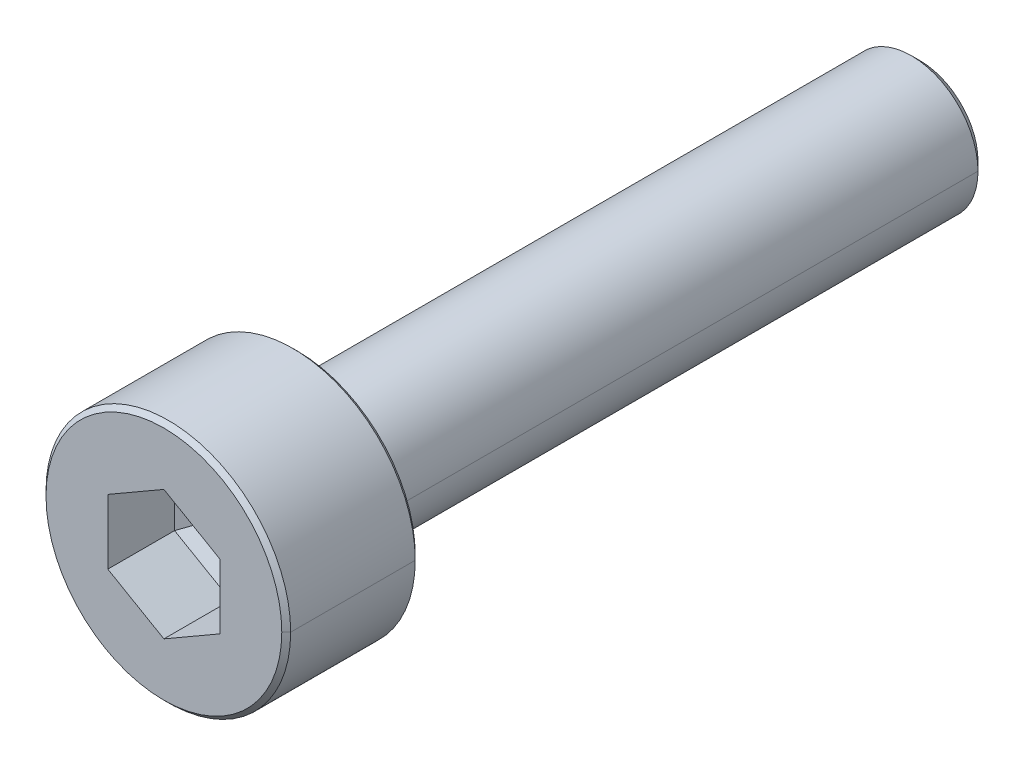
ISO-10303-21;
HEADER;
FILE_DESCRIPTION(('STEP AP214'),'2;1');
FILE_NAME('part.step','',(''),(''),'','','');
FILE_SCHEMA(('AUTOMOTIVE_DESIGN { 1 0 10303 214 1 1 1 1 }'));
ENDSEC;
DATA;
#1=APPLICATION_CONTEXT('core data for automotive mechanical design processes');
#2=APPLICATION_PROTOCOL_DEFINITION('international standard','automotive_design',2000,#1);
#3=PRODUCT_CONTEXT('',#1,'mechanical');
#4=PRODUCT('Part','Part','',(#3));
#5=PRODUCT_RELATED_PRODUCT_CATEGORY('part','',(#4));
#6=PRODUCT_DEFINITION_FORMATION('','',#4);
#7=PRODUCT_DEFINITION_CONTEXT('part definition',#1,'design');
#8=PRODUCT_DEFINITION('design','',#6,#7);
#9=PRODUCT_DEFINITION_SHAPE('','',#8);
#10=(LENGTH_UNIT() NAMED_UNIT(*) SI_UNIT(.MILLI.,.METRE.));
#11=(NAMED_UNIT(*) PLANE_ANGLE_UNIT() SI_UNIT($,.RADIAN.));
#12=(NAMED_UNIT(*) SI_UNIT($,.STERADIAN.) SOLID_ANGLE_UNIT());
#13=UNCERTAINTY_MEASURE_WITH_UNIT(LENGTH_MEASURE(1.E-05),#10,'distance_accuracy_value','');
#14=(GEOMETRIC_REPRESENTATION_CONTEXT(3) GLOBAL_UNCERTAINTY_ASSIGNED_CONTEXT((#13)) GLOBAL_UNIT_ASSIGNED_CONTEXT((#10,
#11,#12)) REPRESENTATION_CONTEXT('',''));
#15=CARTESIAN_POINT('',(0.,0.,0.));
#16=DIRECTION('',(0.,0.,1.));
#17=DIRECTION('',(1.,0.,0.));
#18=AXIS2_PLACEMENT_3D('',#15,#16,#17);
#19=CARTESIAN_POINT('',(0.,0.,14.));
#20=DIRECTION('',(0.,0.,1.));
#21=DIRECTION('',(1.,0.,0.));
#22=AXIS2_PLACEMENT_3D('',#19,#20,#21);
#23=CYLINDRICAL_SURFACE('',#22,2.75);
#24=DIRECTION('',(0.,0.,1.));
#25=VECTOR('',#24,1.);
#26=CARTESIAN_POINT('',(2.749999568692,9.559333062462E-10,14.10000043111));
#27=LINE('',#26,#25);
#28=CARTESIAN_POINT('',(2.75,0.,14.10000119242));
#29=VERTEX_POINT('',#28);
#30=CARTESIAN_POINT('',(2.75,0.,16.89999880758));
#31=VERTEX_POINT('',#30);
#32=EDGE_CURVE('E187',#29,#31,#27,.T.);
#33=ORIENTED_EDGE('',*,*,#32,.F.);
#34=CARTESIAN_POINT('',(0.,0.,14.10000119242));
#35=DIRECTION('',(0.,0.,-1.));
#36=DIRECTION('',(-1.,0.,0.));
#37=AXIS2_PLACEMENT_3D('',#34,#35,#36);
#38=CIRCLE('',#37,2.75);
#39=CARTESIAN_POINT('',(-2.75,0.,14.10000119242));
#40=VERTEX_POINT('',#39);
#41=EDGE_CURVE('E192',#40,#29,#38,.T.);
#42=ORIENTED_EDGE('',*,*,#41,.F.);
#43=DIRECTION('',(0.,0.,1.));
#44=VECTOR('',#43,1.);
#45=CARTESIAN_POINT('',(-2.749999568692,-9.559333071736E-10,14.10000043111));
#46=LINE('',#45,#44);
#47=CARTESIAN_POINT('',(-2.75,0.,16.89999880758));
#48=VERTEX_POINT('',#47);
#49=EDGE_CURVE('E185',#40,#48,#46,.T.);
#50=ORIENTED_EDGE('',*,*,#49,.T.);
#51=CARTESIAN_POINT('',(0.,0.,16.89999880758));
#52=DIRECTION('',(0.,0.,1.));
#53=DIRECTION('',(1.,0.,0.));
#54=AXIS2_PLACEMENT_3D('',#51,#52,#53);
#55=CIRCLE('',#54,2.75);
#56=EDGE_CURVE('E10',#31,#48,#55,.T.);
#57=ORIENTED_EDGE('',*,*,#56,.F.);
#58=EDGE_LOOP('',(#33,#42,#50,#57));
#59=FACE_BOUND('',#58,.T.);
#60=ADVANCED_FACE('F15',(#59),#23,.T.);
#61=CARTESIAN_POINT('',(0.,0.,16.94999899865));
#62=DIRECTION('',(0.,0.,-1.));
#63=DIRECTION('',(0.,-1.,0.));
#64=AXIS2_PLACEMENT_3D('',#61,#62,#63);
#65=CONICAL_SURFACE('',#64,2.699999307864,0.785397849788861);
#66=DIRECTION('',(0.707107649724914,-1.92542801598204E-09,-0.707105912647114));
#67=VECTOR('',#66,1.);
#68=CARTESIAN_POINT('',(2.649999445834,1.228229975434E-09,16.99999944608));
#69=LINE('',#68,#67);
#70=CARTESIAN_POINT('',(2.649998601523,0.,16.99999973635));
#71=VERTEX_POINT('',#70);
#72=EDGE_CURVE('E168',#71,#31,#69,.T.);
#73=ORIENTED_EDGE('',*,*,#72,.T.);
#74=ORIENTED_EDGE('',*,*,#56,.T.);
#75=DIRECTION('',(-0.707107649724914,1.92542895826004E-09,-0.707105912647114));
#76=VECTOR('',#75,1.);
#77=CARTESIAN_POINT('',(-2.649999445834,-1.228230359421E-09,16.99999944608));
#78=LINE('',#77,#76);
#79=CARTESIAN_POINT('',(-2.649998601523,0.,16.99999973635));
#80=VERTEX_POINT('',#79);
#81=EDGE_CURVE('E166',#80,#48,#78,.T.);
#82=ORIENTED_EDGE('',*,*,#81,.F.);
#83=CARTESIAN_POINT('',(0.,0.,16.99999973635));
#84=DIRECTION('',(0.,0.,1.));
#85=DIRECTION('',(1.,0.,0.));
#86=AXIS2_PLACEMENT_3D('',#83,#84,#85);
#87=CIRCLE('',#86,2.649998601523);
#88=EDGE_CURVE('E214',#71,#80,#87,.T.);
#89=ORIENTED_EDGE('',*,*,#88,.F.);
#90=EDGE_LOOP('',(#73,#74,#82,#89));
#91=FACE_BOUND('',#90,.T.);
#92=ADVANCED_FACE('F17',(#91),#65,.T.);
#93=CARTESIAN_POINT('',(0.,0.,14.75));
#94=DIRECTION('',(0.,0.,1.));
#95=DIRECTION('',(1.,0.,0.));
#96=AXIS2_PLACEMENT_3D('',#93,#94,#95);
#97=PLANE('',#96);
#98=DIRECTION('',(-0.866025403784429,0.500000000000017,0.));
#99=VECTOR('',#98,1.);
#100=CARTESIAN_POINT('',(0.08660254037844,0.05,14.75));
#101=LINE('',#100,#99);
#102=CARTESIAN_POINT('',(0.08660254037844,0.05,14.75));
#103=VERTEX_POINT('',#102);
#104=CARTESIAN_POINT('',(0.,0.1,14.75));
#105=VERTEX_POINT('',#104);
#106=EDGE_CURVE('E256',#103,#105,#101,.T.);
#107=ORIENTED_EDGE('',*,*,#106,.T.);
#108=DIRECTION('',(-0.866025403784429,-0.500000000000017,0.));
#109=VECTOR('',#108,1.);
#110=CARTESIAN_POINT('',(0.,0.1,14.75));
#111=LINE('',#110,#109);
#112=CARTESIAN_POINT('',(-0.08660254037844,0.05,14.75));
#113=VERTEX_POINT('',#112);
#114=EDGE_CURVE('E207',#105,#113,#111,.T.);
#115=ORIENTED_EDGE('',*,*,#114,.T.);
#116=DIRECTION('',(0.,-1.,0.));
#117=VECTOR('',#116,1.);
#118=CARTESIAN_POINT('',(-0.08660254037844,0.05,14.75));
#119=LINE('',#118,#117);
#120=CARTESIAN_POINT('',(-0.08660254037844,-0.05,14.75));
#121=VERTEX_POINT('',#120);
#122=EDGE_CURVE('E36',#113,#121,#119,.T.);
#123=ORIENTED_EDGE('',*,*,#122,.T.);
#124=DIRECTION('',(0.866025403784429,-0.500000000000017,0.));
#125=VECTOR('',#124,1.);
#126=CARTESIAN_POINT('',(-0.08660254037844,-0.05,14.75));
#127=LINE('',#126,#125);
#128=CARTESIAN_POINT('',(0.,-0.1,14.75));
#129=VERTEX_POINT('',#128);
#130=EDGE_CURVE('E218',#121,#129,#127,.T.);
#131=ORIENTED_EDGE('',*,*,#130,.T.);
#132=DIRECTION('',(0.866025403784429,0.500000000000017,0.));
#133=VECTOR('',#132,1.);
#134=CARTESIAN_POINT('',(0.,-0.1,14.75));
#135=LINE('',#134,#133);
#136=CARTESIAN_POINT('',(0.08660254037844,-0.05,14.75));
#137=VERTEX_POINT('',#136);
#138=EDGE_CURVE('E267',#129,#137,#135,.T.);
#139=ORIENTED_EDGE('',*,*,#138,.T.);
#140=DIRECTION('',(0.,1.,0.));
#141=VECTOR('',#140,1.);
#142=CARTESIAN_POINT('',(0.08660254037844,-0.05,14.75));
#143=LINE('',#142,#141);
#144=EDGE_CURVE('E279',#137,#103,#143,.T.);
#145=ORIENTED_EDGE('',*,*,#144,.T.);
#146=EDGE_LOOP('',(#107,#115,#123,#131,#139,#145));
#147=FACE_BOUND('',#146,.T.);
#148=ADVANCED_FACE('F383',(#147),#97,.T.);
#149=CARTESIAN_POINT('',(-1.26,0.7274613391789,17.));
#150=DIRECTION('',(-1.,0.,0.));
#151=DIRECTION('',(0.,0.,1.));
#152=AXIS2_PLACEMENT_3D('',#149,#150,#151);
#153=PLANE('',#152);
#154=DIRECTION('',(0.,0.,-1.));
#155=VECTOR('',#154,1.);
#156=CARTESIAN_POINT('',(-1.26,0.7274613391789,17.));
#157=LINE('',#156,#155);
#158=CARTESIAN_POINT('',(-1.26,0.7274613391789,17.));
#159=VERTEX_POINT('',#158);
#160=CARTESIAN_POINT('',(-1.26,0.7274613391789,15.5));
#161=VERTEX_POINT('',#160);
#162=EDGE_CURVE('E246',#159,#161,#157,.T.);
#163=ORIENTED_EDGE('',*,*,#162,.F.);
#164=DIRECTION('',(0.,-1.,0.));
#165=VECTOR('',#164,1.);
#166=CARTESIAN_POINT('',(-1.26,0.7274613391789,17.));
#167=LINE('',#166,#165);
#168=CARTESIAN_POINT('',(-1.26,-0.7274613391789,17.));
#169=VERTEX_POINT('',#168);
#170=EDGE_CURVE('E237',#159,#169,#167,.T.);
#171=ORIENTED_EDGE('',*,*,#170,.T.);
#172=DIRECTION('',(0.,0.,-1.));
#173=VECTOR('',#172,1.);
#174=CARTESIAN_POINT('',(-1.26,-0.7274613391789,17.));
#175=LINE('',#174,#173);
#176=CARTESIAN_POINT('',(-1.26,-0.7274613391789,15.5));
#177=VERTEX_POINT('',#176);
#178=EDGE_CURVE('E292',#169,#177,#175,.T.);
#179=ORIENTED_EDGE('',*,*,#178,.T.);
#180=DIRECTION('',(0.,-1.,0.));
#181=VECTOR('',#180,1.);
#182=CARTESIAN_POINT('',(-1.26,0.7274613391789,15.5));
#183=LINE('',#182,#181);
#184=EDGE_CURVE('E24',#161,#177,#183,.T.);
#185=ORIENTED_EDGE('',*,*,#184,.F.);
#186=EDGE_LOOP('',(#163,#171,#179,#185));
#187=FACE_BOUND('',#186,.T.);
#188=ADVANCED_FACE('F388',(#187),#153,.F.);
#189=CARTESIAN_POINT('',(-0.6733012701892,0.,15.125));
#190=DIRECTION('',(-0.538557238596109,0.,-0.842588927506013));
#191=DIRECTION('',(-0.842588927506013,0.,0.538557238596109));
#192=AXIS2_PLACEMENT_3D('',#189,#190,#191);
#193=PLANE('',#192);
#194=DIRECTION('',(-0.757690757673019,-0.437452962905011,0.484292908251312));
#195=VECTOR('',#194,1.);
#196=CARTESIAN_POINT('',(-0.08660254037844,-0.05,14.75));
#197=LINE('',#196,#195);
#198=EDGE_CURVE('E215',#121,#177,#197,.T.);
#199=ORIENTED_EDGE('',*,*,#198,.F.);
#200=ORIENTED_EDGE('',*,*,#122,.F.);
#201=DIRECTION('',(-0.757690757673019,0.437452962905011,0.484292908251312));
#202=VECTOR('',#201,1.);
#203=CARTESIAN_POINT('',(-0.08660254037844,0.05,14.75));
#204=LINE('',#203,#202);
#205=EDGE_CURVE('E205',#113,#161,#204,.T.);
#206=ORIENTED_EDGE('',*,*,#205,.T.);
#207=ORIENTED_EDGE('',*,*,#184,.T.);
#208=EDGE_LOOP('',(#199,#200,#206,#207));
#209=FACE_BOUND('',#208,.T.);
#210=ADVANCED_FACE('F531',(#209),#193,.F.);
#211=CARTESIAN_POINT('',(-0.3366506350946,-0.5830960043842,15.125));
#212=DIRECTION('',(-0.269278619298103,-0.466404250016206,-0.84258892750601));
#213=DIRECTION('',(0.,-0.874905925810061,0.484292908251236));
#214=AXIS2_PLACEMENT_3D('',#211,#212,#213);
#215=PLANE('',#214);
#216=DIRECTION('',(0.,-0.87490592581002,0.484292908251311));
#217=VECTOR('',#216,1.);
#218=CARTESIAN_POINT('',(0.,-0.1,14.75));
#219=LINE('',#218,#217);
#220=CARTESIAN_POINT('',(0.,-1.454922678358,15.5));
#221=VERTEX_POINT('',#220);
#222=EDGE_CURVE('E270',#129,#221,#219,.T.);
#223=ORIENTED_EDGE('',*,*,#222,.F.);
#224=ORIENTED_EDGE('',*,*,#130,.F.);
#225=ORIENTED_EDGE('',*,*,#198,.T.);
#226=DIRECTION('',(0.866025403784429,-0.500000000000017,0.));
#227=VECTOR('',#226,1.);
#228=CARTESIAN_POINT('',(-1.26,-0.7274613391789,15.5));
#229=LINE('',#228,#227);
#230=EDGE_CURVE('E296',#177,#221,#229,.T.);
#231=ORIENTED_EDGE('',*,*,#230,.T.);
#232=EDGE_LOOP('',(#223,#224,#225,#231));
#233=FACE_BOUND('',#232,.T.);
#234=ADVANCED_FACE('F521',(#233),#215,.F.);
#235=CARTESIAN_POINT('',(-1.26,-0.7274613391789,17.));
#236=DIRECTION('',(-0.500000000000017,-0.866025403784429,0.));
#237=DIRECTION('',(-0.866025403784429,0.500000000000017,0.));
#238=AXIS2_PLACEMENT_3D('',#235,#236,#237);
#239=PLANE('',#238);
#240=ORIENTED_EDGE('',*,*,#178,.F.);
#241=DIRECTION('',(0.866025403784429,-0.500000000000017,0.));
#242=VECTOR('',#241,1.);
#243=CARTESIAN_POINT('',(-1.26,-0.7274613391789,17.));
#244=LINE('',#243,#242);
#245=CARTESIAN_POINT('',(0.,-1.454922678358,17.));
#246=VERTEX_POINT('',#245);
#247=EDGE_CURVE('E233',#169,#246,#244,.T.);
#248=ORIENTED_EDGE('',*,*,#247,.T.);
#249=DIRECTION('',(0.,0.,-1.));
#250=VECTOR('',#249,1.);
#251=CARTESIAN_POINT('',(0.,-1.454922678358,17.));
#252=LINE('',#251,#250);
#253=EDGE_CURVE('E291',#246,#221,#252,.T.);
#254=ORIENTED_EDGE('',*,*,#253,.T.);
#255=ORIENTED_EDGE('',*,*,#230,.F.);
#256=EDGE_LOOP('',(#240,#248,#254,#255));
#257=FACE_BOUND('',#256,.T.);
#258=ADVANCED_FACE('F511',(#257),#239,.F.);
#259=CARTESIAN_POINT('',(0.,-1.454922678358,17.));
#260=DIRECTION('',(0.500000000000017,-0.866025403784429,0.));
#261=DIRECTION('',(0.,0.,-1.));
#262=AXIS2_PLACEMENT_3D('',#259,#260,#261);
#263=PLANE('',#262);
#264=ORIENTED_EDGE('',*,*,#253,.F.);
#265=DIRECTION('',(0.866025403784429,0.500000000000017,0.));
#266=VECTOR('',#265,1.);
#267=CARTESIAN_POINT('',(0.,-1.454922678358,17.));
#268=LINE('',#267,#266);
#269=CARTESIAN_POINT('',(1.26,-0.7274613391789,17.));
#270=VERTEX_POINT('',#269);
#271=EDGE_CURVE('E229',#246,#270,#268,.T.);
#272=ORIENTED_EDGE('',*,*,#271,.T.);
#273=DIRECTION('',(0.,0.,-1.));
#274=VECTOR('',#273,1.);
#275=CARTESIAN_POINT('',(1.26,-0.7274613391789,17.));
#276=LINE('',#275,#274);
#277=CARTESIAN_POINT('',(1.26,-0.7274613391789,15.5));
#278=VERTEX_POINT('',#277);
#279=EDGE_CURVE('E272',#270,#278,#276,.T.);
#280=ORIENTED_EDGE('',*,*,#279,.T.);
#281=DIRECTION('',(0.866025403784429,0.500000000000017,0.));
#282=VECTOR('',#281,1.);
#283=CARTESIAN_POINT('',(0.,-1.454922678358,15.5));
#284=LINE('',#283,#282);
#285=EDGE_CURVE('E288',#221,#278,#284,.T.);
#286=ORIENTED_EDGE('',*,*,#285,.F.);
#287=EDGE_LOOP('',(#264,#272,#280,#286));
#288=FACE_BOUND('',#287,.T.);
#289=ADVANCED_FACE('F501',(#288),#263,.F.);
#290=CARTESIAN_POINT('',(0.3366506350946,-0.5830960043842,15.125));
#291=DIRECTION('',(0.269278619298103,-0.466404250016206,-0.84258892750601));
#292=DIRECTION('',(0.,-0.874905925810061,0.484292908251236));
#293=AXIS2_PLACEMENT_3D('',#290,#291,#292);
#294=PLANE('',#293);
#295=DIRECTION('',(0.757690757673019,-0.437452962905011,0.484292908251312));
#296=VECTOR('',#295,1.);
#297=CARTESIAN_POINT('',(0.08660254037844,-0.05,14.75));
#298=LINE('',#297,#296);
#299=EDGE_CURVE('E271',#137,#278,#298,.T.);
#300=ORIENTED_EDGE('',*,*,#299,.F.);
#301=ORIENTED_EDGE('',*,*,#138,.F.);
#302=ORIENTED_EDGE('',*,*,#222,.T.);
#303=ORIENTED_EDGE('',*,*,#285,.T.);
#304=EDGE_LOOP('',(#300,#301,#302,#303));
#305=FACE_BOUND('',#304,.T.);
#306=ADVANCED_FACE('F491',(#305),#294,.F.);
#307=CARTESIAN_POINT('',(0.6733012701892,0.,15.125));
#308=DIRECTION('',(0.538557238596109,0.,-0.842588927506013));
#309=DIRECTION('',(0.,-1.,0.));
#310=AXIS2_PLACEMENT_3D('',#307,#308,#309);
#311=PLANE('',#310);
#312=DIRECTION('',(0.757690757673019,0.437452962905011,0.484292908251312));
#313=VECTOR('',#312,1.);
#314=CARTESIAN_POINT('',(0.08660254037844,0.05,14.75));
#315=LINE('',#314,#313);
#316=CARTESIAN_POINT('',(1.26,0.7274613391789,15.5));
#317=VERTEX_POINT('',#316);
#318=EDGE_CURVE('E259',#103,#317,#315,.T.);
#319=ORIENTED_EDGE('',*,*,#318,.F.);
#320=ORIENTED_EDGE('',*,*,#144,.F.);
#321=ORIENTED_EDGE('',*,*,#299,.T.);
#322=DIRECTION('',(0.,1.,0.));
#323=VECTOR('',#322,1.);
#324=CARTESIAN_POINT('',(1.26,-0.7274613391789,15.5));
#325=LINE('',#324,#323);
#326=EDGE_CURVE('E276',#278,#317,#325,.T.);
#327=ORIENTED_EDGE('',*,*,#326,.T.);
#328=EDGE_LOOP('',(#319,#320,#321,#327));
#329=FACE_BOUND('',#328,.T.);
#330=ADVANCED_FACE('F454',(#329),#311,.F.);
#331=CARTESIAN_POINT('',(1.26,-0.7274613391789,17.));
#332=DIRECTION('',(1.,0.,0.));
#333=DIRECTION('',(0.,1.,0.));
#334=AXIS2_PLACEMENT_3D('',#331,#332,#333);
#335=PLANE('',#334);
#336=ORIENTED_EDGE('',*,*,#279,.F.);
#337=DIRECTION('',(0.,1.,0.));
#338=VECTOR('',#337,1.);
#339=CARTESIAN_POINT('',(1.26,-0.7274613391789,17.));
#340=LINE('',#339,#338);
#341=CARTESIAN_POINT('',(1.26,0.7274613391789,17.));
#342=VERTEX_POINT('',#341);
#343=EDGE_CURVE('E225',#270,#342,#340,.T.);
#344=ORIENTED_EDGE('',*,*,#343,.T.);
#345=DIRECTION('',(0.,0.,-1.));
#346=VECTOR('',#345,1.);
#347=CARTESIAN_POINT('',(1.26,0.7274613391789,17.));
#348=LINE('',#347,#346);
#349=EDGE_CURVE('E266',#342,#317,#348,.T.);
#350=ORIENTED_EDGE('',*,*,#349,.T.);
#351=ORIENTED_EDGE('',*,*,#326,.F.);
#352=EDGE_LOOP('',(#336,#344,#350,#351));
#353=FACE_BOUND('',#352,.T.);
#354=ADVANCED_FACE('F448',(#353),#335,.F.);
#355=CARTESIAN_POINT('',(1.26,0.7274613391789,17.));
#356=DIRECTION('',(0.500000000000017,0.866025403784429,0.));
#357=DIRECTION('',(0.,0.,-1.));
#358=AXIS2_PLACEMENT_3D('',#355,#356,#357);
#359=PLANE('',#358);
#360=ORIENTED_EDGE('',*,*,#349,.F.);
#361=DIRECTION('',(-0.866025403784429,0.500000000000017,0.));
#362=VECTOR('',#361,1.);
#363=CARTESIAN_POINT('',(1.26,0.7274613391789,17.));
#364=LINE('',#363,#362);
#365=CARTESIAN_POINT('',(0.,1.454922678358,17.));
#366=VERTEX_POINT('',#365);
#367=EDGE_CURVE('E221',#342,#366,#364,.T.);
#368=ORIENTED_EDGE('',*,*,#367,.T.);
#369=DIRECTION('',(0.,0.,-1.));
#370=VECTOR('',#369,1.);
#371=CARTESIAN_POINT('',(0.,1.454922678358,17.));
#372=LINE('',#371,#370);
#373=CARTESIAN_POINT('',(0.,1.454922678358,15.5));
#374=VERTEX_POINT('',#373);
#375=EDGE_CURVE('E242',#366,#374,#372,.T.);
#376=ORIENTED_EDGE('',*,*,#375,.T.);
#377=DIRECTION('',(-0.866025403784429,0.500000000000017,0.));
#378=VECTOR('',#377,1.);
#379=CARTESIAN_POINT('',(1.26,0.7274613391789,15.5));
#380=LINE('',#379,#378);
#381=EDGE_CURVE('E263',#317,#374,#380,.T.);
#382=ORIENTED_EDGE('',*,*,#381,.F.);
#383=EDGE_LOOP('',(#360,#368,#376,#382));
#384=FACE_BOUND('',#383,.T.);
#385=ADVANCED_FACE('F453',(#384),#359,.F.);
#386=CARTESIAN_POINT('',(0.3366506350946,0.5830960043842,15.125));
#387=DIRECTION('',(0.269278619298103,0.466404250016206,-0.84258892750601));
#388=DIRECTION('',(-0.952538880218884,0.,-0.30441695365297));
#389=AXIS2_PLACEMENT_3D('',#386,#387,#388);
#390=PLANE('',#389);
#391=DIRECTION('',(0.,0.87490592581002,0.484292908251311));
#392=VECTOR('',#391,1.);
#393=CARTESIAN_POINT('',(0.,0.1,14.75));
#394=LINE('',#393,#392);
#395=EDGE_CURVE('E252',#105,#374,#394,.T.);
#396=ORIENTED_EDGE('',*,*,#395,.F.);
#397=ORIENTED_EDGE('',*,*,#106,.F.);
#398=ORIENTED_EDGE('',*,*,#318,.T.);
#399=ORIENTED_EDGE('',*,*,#381,.T.);
#400=EDGE_LOOP('',(#396,#397,#398,#399));
#401=FACE_BOUND('',#400,.T.);
#402=ADVANCED_FACE('F465',(#401),#390,.F.);
#403=CARTESIAN_POINT('',(-0.3366506350946,0.5830960043842,15.125));
#404=DIRECTION('',(-0.269278619298103,0.466404250016206,-0.84258892750601));
#405=DIRECTION('',(-0.952538880218884,0.,0.30441695365297));
#406=AXIS2_PLACEMENT_3D('',#403,#404,#405);
#407=PLANE('',#406);
#408=ORIENTED_EDGE('',*,*,#205,.F.);
#409=ORIENTED_EDGE('',*,*,#114,.F.);
#410=ORIENTED_EDGE('',*,*,#395,.T.);
#411=DIRECTION('',(-0.866025403784429,-0.500000000000017,0.));
#412=VECTOR('',#411,1.);
#413=CARTESIAN_POINT('',(0.,1.454922678358,15.5));
#414=LINE('',#413,#412);
#415=EDGE_CURVE('E208',#374,#161,#414,.T.);
#416=ORIENTED_EDGE('',*,*,#415,.T.);
#417=EDGE_LOOP('',(#408,#409,#410,#416));
#418=FACE_BOUND('',#417,.T.);
#419=ADVANCED_FACE('F433',(#418),#407,.F.);
#420=CARTESIAN_POINT('',(0.,1.454922678358,17.));
#421=DIRECTION('',(-0.500000000000017,0.866025403784429,0.));
#422=DIRECTION('',(0.,0.,1.));
#423=AXIS2_PLACEMENT_3D('',#420,#421,#422);
#424=PLANE('',#423);
#425=ORIENTED_EDGE('',*,*,#375,.F.);
#426=DIRECTION('',(-0.866025403784429,-0.500000000000017,0.));
#427=VECTOR('',#426,1.);
#428=CARTESIAN_POINT('',(0.,1.454922678358,17.));
#429=LINE('',#428,#427);
#430=EDGE_CURVE('E238',#366,#159,#429,.T.);
#431=ORIENTED_EDGE('',*,*,#430,.T.);
#432=ORIENTED_EDGE('',*,*,#162,.T.);
#433=ORIENTED_EDGE('',*,*,#415,.F.);
#434=EDGE_LOOP('',(#425,#431,#432,#433));
#435=FACE_BOUND('',#434,.T.);
#436=ADVANCED_FACE('F428',(#435),#424,.F.);
#437=CARTESIAN_POINT('',(0.,0.,17.));
#438=DIRECTION('',(0.,0.,1.));
#439=DIRECTION('',(1.,0.,0.));
#440=AXIS2_PLACEMENT_3D('',#437,#438,#439);
#441=PLANE('',#440);
#442=ORIENTED_EDGE('',*,*,#367,.F.);
#443=ORIENTED_EDGE('',*,*,#343,.F.);
#444=ORIENTED_EDGE('',*,*,#271,.F.);
#445=ORIENTED_EDGE('',*,*,#247,.F.);
#446=ORIENTED_EDGE('',*,*,#170,.F.);
#447=ORIENTED_EDGE('',*,*,#430,.F.);
#448=EDGE_LOOP('',(#442,#443,#444,#445,#446,#447));
#449=FACE_BOUND('',#448,.T.);
#450=CARTESIAN_POINT('',(0.,0.,16.99999973635));
#451=DIRECTION('',(0.,0.,1.));
#452=DIRECTION('',(-1.,0.,0.));
#453=AXIS2_PLACEMENT_3D('',#450,#451,#452);
#454=CIRCLE('',#453,2.649998601523);
#455=EDGE_CURVE('E179',#80,#71,#454,.T.);
#456=ORIENTED_EDGE('',*,*,#455,.T.);
#457=ORIENTED_EDGE('',*,*,#88,.T.);
#458=EDGE_LOOP('',(#456,#457));
#459=FACE_BOUND('',#458,.T.);
#460=ADVANCED_FACE('F414',(#449,#459),#441,.T.);
#461=CARTESIAN_POINT('',(0.,0.,16.94999899865));
#462=DIRECTION('',(0.,0.,-1.));
#463=DIRECTION('',(0.,-1.,0.));
#464=AXIS2_PLACEMENT_3D('',#461,#462,#463);
#465=CONICAL_SURFACE('',#464,2.699999307864,0.785397849788861);
#466=ORIENTED_EDGE('',*,*,#81,.T.);
#467=CARTESIAN_POINT('',(0.,0.,16.89999880758));
#468=DIRECTION('',(0.,0.,1.));
#469=DIRECTION('',(-1.,0.,0.));
#470=AXIS2_PLACEMENT_3D('',#467,#468,#469);
#471=CIRCLE('',#470,2.75);
#472=EDGE_CURVE('E176',#48,#31,#471,.T.);
#473=ORIENTED_EDGE('',*,*,#472,.T.);
#474=ORIENTED_EDGE('',*,*,#72,.F.);
#475=ORIENTED_EDGE('',*,*,#455,.F.);
#476=EDGE_LOOP('',(#466,#473,#474,#475));
#477=FACE_BOUND('',#476,.T.);
#478=ADVANCED_FACE('F175',(#477),#465,.T.);
#479=CARTESIAN_POINT('',(0.,0.,14.));
#480=DIRECTION('',(0.,0.,1.));
#481=DIRECTION('',(1.,0.,0.));
#482=AXIS2_PLACEMENT_3D('',#479,#480,#481);
#483=CYLINDRICAL_SURFACE('',#482,2.75);
#484=ORIENTED_EDGE('',*,*,#49,.F.);
#485=CARTESIAN_POINT('',(0.,0.,14.10000119242));
#486=DIRECTION('',(0.,0.,-1.));
#487=DIRECTION('',(1.,0.,0.));
#488=AXIS2_PLACEMENT_3D('',#485,#486,#487);
#489=CIRCLE('',#488,2.75);
#490=EDGE_CURVE('E195',#29,#40,#489,.T.);
#491=ORIENTED_EDGE('',*,*,#490,.F.);
#492=ORIENTED_EDGE('',*,*,#32,.T.);
#493=ORIENTED_EDGE('',*,*,#472,.F.);
#494=EDGE_LOOP('',(#484,#491,#492,#493));
#495=FACE_BOUND('',#494,.T.);
#496=ADVANCED_FACE('F183',(#495),#483,.T.);
#497=CARTESIAN_POINT('',(0.,0.,14.05000100135));
#498=DIRECTION('',(0.,0.,1.));
#499=DIRECTION('',(0.,-1.,0.));
#500=AXIS2_PLACEMENT_3D('',#497,#498,#499);
#501=CONICAL_SURFACE('',#500,2.699999307864,0.785397849788861);
#502=DIRECTION('',(0.707107649724914,-1.92542564776104E-09,0.707105912647114));
#503=VECTOR('',#502,1.);
#504=CARTESIAN_POINT('',(2.649999445834,1.228229612762E-09,14.00000055392));
#505=LINE('',#504,#503);
#506=CARTESIAN_POINT('',(2.649998601523,0.,14.00000026365));
#507=VERTEX_POINT('',#506);
#508=EDGE_CURVE('E201',#507,#29,#505,.T.);
#509=ORIENTED_EDGE('',*,*,#508,.T.);
#510=ORIENTED_EDGE('',*,*,#490,.T.);
#511=DIRECTION('',(-0.707107649724914,1.92542516412204E-09,0.707105912647114));
#512=VECTOR('',#511,1.);
#513=CARTESIAN_POINT('',(-2.649999445834,-1.228229545292E-09,14.00000055392));
#514=LINE('',#513,#512);
#515=CARTESIAN_POINT('',(-2.649998601523,0.,14.00000026365));
#516=VERTEX_POINT('',#515);
#517=EDGE_CURVE('E633',#516,#40,#514,.T.);
#518=ORIENTED_EDGE('',*,*,#517,.F.);
#519=CARTESIAN_POINT('',(0.,0.,14.00000026365));
#520=DIRECTION('',(0.,0.,-1.));
#521=DIRECTION('',(1.,0.,0.));
#522=AXIS2_PLACEMENT_3D('',#519,#520,#521);
#523=CIRCLE('',#522,2.649998601523);
#524=EDGE_CURVE('E634',#507,#516,#523,.T.);
#525=ORIENTED_EDGE('',*,*,#524,.F.);
#526=EDGE_LOOP('',(#509,#510,#518,#525));
#527=FACE_BOUND('',#526,.T.);
#528=ADVANCED_FACE('F315',(#527),#501,.T.);
#529=CARTESIAN_POINT('',(0.,0.,14.05000100135));
#530=DIRECTION('',(0.,0.,1.));
#531=DIRECTION('',(0.,-1.,0.));
#532=AXIS2_PLACEMENT_3D('',#529,#530,#531);
#533=CONICAL_SURFACE('',#532,2.699999307864,0.785397849788861);
#534=ORIENTED_EDGE('',*,*,#517,.T.);
#535=ORIENTED_EDGE('',*,*,#41,.T.);
#536=ORIENTED_EDGE('',*,*,#508,.F.);
#537=CARTESIAN_POINT('',(0.,0.,14.00000026365));
#538=DIRECTION('',(0.,0.,-1.));
#539=DIRECTION('',(-1.,0.,0.));
#540=AXIS2_PLACEMENT_3D('',#537,#538,#539);
#541=CIRCLE('',#540,2.649998601523);
#542=EDGE_CURVE('E629',#516,#507,#541,.T.);
#543=ORIENTED_EDGE('',*,*,#542,.F.);
#544=EDGE_LOOP('',(#534,#535,#536,#543));
#545=FACE_BOUND('',#544,.T.);
#546=ADVANCED_FACE('F309',(#545),#533,.T.);
#547=CARTESIAN_POINT('',(0.,0.,14.));
#548=DIRECTION('',(0.,0.,1.));
#549=DIRECTION('',(1.,0.,0.));
#550=AXIS2_PLACEMENT_3D('',#547,#548,#549);
#551=PLANE('',#550);
#552=CARTESIAN_POINT('',(0.,0.,14.));
#553=DIRECTION('',(0.,0.,1.));
#554=DIRECTION('',(-1.,0.,0.));
#555=AXIS2_PLACEMENT_3D('',#552,#553,#554);
#556=CIRCLE('',#555,1.5);
#557=CARTESIAN_POINT('',(-1.5,0.,14.));
#558=VERTEX_POINT('',#557);
#559=CARTESIAN_POINT('',(1.5,0.,14.));
#560=VERTEX_POINT('',#559);
#561=EDGE_CURVE('E651',#558,#560,#556,.T.);
#562=ORIENTED_EDGE('',*,*,#561,.T.);
#563=CARTESIAN_POINT('',(0.,0.,14.));
#564=DIRECTION('',(0.,0.,1.));
#565=DIRECTION('',(1.,0.,0.));
#566=AXIS2_PLACEMENT_3D('',#563,#564,#565);
#567=CIRCLE('',#566,1.5);
#568=EDGE_CURVE('E638',#560,#558,#567,.T.);
#569=ORIENTED_EDGE('',*,*,#568,.T.);
#570=EDGE_LOOP('',(#562,#569));
#571=FACE_BOUND('',#570,.T.);
#572=ORIENTED_EDGE('',*,*,#524,.T.);
#573=ORIENTED_EDGE('',*,*,#542,.T.);
#574=EDGE_LOOP('',(#572,#573));
#575=FACE_BOUND('',#574,.T.);
#576=ADVANCED_FACE('F314',(#571,#575),#551,.F.);
#577=CARTESIAN_POINT('',(0.,0.,0.));
#578=DIRECTION('',(0.,0.,1.));
#579=DIRECTION('',(1.,0.,0.));
#580=AXIS2_PLACEMENT_3D('',#577,#578,#579);
#581=CYLINDRICAL_SURFACE('',#580,1.5);
#582=DIRECTION('',(-1.64547401428298E-07,2.24357054528797E-12,0.999999999999987));
#583=VECTOR('',#582,1.);
#584=CARTESIAN_POINT('',(-1.499997729246,-3.096108473428E-11,0.2000022703456));
#585=LINE('',#584,#583);
#586=CARTESIAN_POINT('',(-1.5,0.,0.2000015310236));
#587=VERTEX_POINT('',#586);
#588=EDGE_CURVE('E644',#587,#558,#585,.T.);
#589=ORIENTED_EDGE('',*,*,#588,.T.);
#590=ORIENTED_EDGE('',*,*,#568,.F.);
#591=DIRECTION('',(1.64547401428298E-07,-2.24356118356397E-12,0.999999999999987));
#592=VECTOR('',#591,1.);
#593=CARTESIAN_POINT('',(1.499997729246,3.096095554251E-11,0.2000022703456));
#594=LINE('',#593,#592);
#595=CARTESIAN_POINT('',(1.5,0.,0.2000015310236));
#596=VERTEX_POINT('',#595);
#597=EDGE_CURVE('E655',#596,#560,#594,.T.);
#598=ORIENTED_EDGE('',*,*,#597,.F.);
#599=CARTESIAN_POINT('',(0.,0.,0.2000015310236));
#600=DIRECTION('',(0.,0.,-1.));
#601=DIRECTION('',(-1.,0.,0.));
#602=AXIS2_PLACEMENT_3D('',#599,#600,#601);
#603=CIRCLE('',#602,1.5);
#604=EDGE_CURVE('E667',#587,#596,#603,.T.);
#605=ORIENTED_EDGE('',*,*,#604,.F.);
#606=EDGE_LOOP('',(#589,#590,#598,#605));
#607=FACE_BOUND('',#606,.T.);
#608=ADVANCED_FACE('F345',(#607),#581,.T.);
#609=CARTESIAN_POINT('',(0.,0.,0.));
#610=DIRECTION('',(0.,0.,1.));
#611=DIRECTION('',(1.,0.,0.));
#612=AXIS2_PLACEMENT_3D('',#609,#610,#611);
#613=CYLINDRICAL_SURFACE('',#612,1.5);
#614=ORIENTED_EDGE('',*,*,#597,.T.);
#615=ORIENTED_EDGE('',*,*,#561,.F.);
#616=ORIENTED_EDGE('',*,*,#588,.F.);
#617=CARTESIAN_POINT('',(0.,0.,0.2000015310236));
#618=DIRECTION('',(0.,0.,-1.));
#619=DIRECTION('',(1.,0.,0.));
#620=AXIS2_PLACEMENT_3D('',#617,#618,#619);
#621=CIRCLE('',#620,1.5);
#622=EDGE_CURVE('E662',#596,#587,#621,.T.);
#623=ORIENTED_EDGE('',*,*,#622,.F.);
#624=EDGE_LOOP('',(#614,#615,#616,#623));
#625=FACE_BOUND('',#624,.T.);
#626=ADVANCED_FACE('F350',(#625),#613,.T.);
#627=CARTESIAN_POINT('',(0.,0.,0.1000047204469));
#628=DIRECTION('',(0.,0.,1.));
#629=DIRECTION('',(0.,-1.,0.));
#630=AXIS2_PLACEMENT_3D('',#627,#628,#629);
#631=CONICAL_SURFACE('',#630,1.399996243725,0.7853951359977);
#632=DIRECTION('',(0.707108029924095,-1.70281150085399E-11,0.707105532446795));
#633=VECTOR('',#632,1.);
#634=CARTESIAN_POINT('',(1.299997376018,3.577723378062E-11,2.623510518015E-06));
#635=LINE('',#634,#633);
#636=CARTESIAN_POINT('',(1.299995410297,0.,3.28153175766E-06));
#637=VERTEX_POINT('',#636);
#638=EDGE_CURVE('E669',#637,#596,#635,.T.);
#639=ORIENTED_EDGE('',*,*,#638,.T.);
#640=ORIENTED_EDGE('',*,*,#622,.T.);
#641=DIRECTION('',(-0.707108029924095,1.70280201582999E-11,0.707105532446795));
#642=VECTOR('',#641,1.);
#643=CARTESIAN_POINT('',(-1.299997376018,-3.577733614469E-11,2.623510517793E-06));
#644=LINE('',#643,#642);
#645=CARTESIAN_POINT('',(-1.299995410297,0.,3.28153175766E-06));
#646=VERTEX_POINT('',#645);
#647=EDGE_CURVE('E663',#646,#587,#644,.T.);
#648=ORIENTED_EDGE('',*,*,#647,.F.);
#649=CARTESIAN_POINT('',(0.,0.,3.28153175766E-06));
#650=DIRECTION('',(0.,0.,-1.));
#651=DIRECTION('',(1.,0.,0.));
#652=AXIS2_PLACEMENT_3D('',#649,#650,#651);
#653=CIRCLE('',#652,1.299995410297);
#654=EDGE_CURVE('E676',#637,#646,#653,.T.);
#655=ORIENTED_EDGE('',*,*,#654,.F.);
#656=EDGE_LOOP('',(#639,#640,#648,#655));
#657=FACE_BOUND('',#656,.T.);
#658=ADVANCED_FACE('F360',(#657),#631,.T.);
#659=CARTESIAN_POINT('',(0.,0.,0.1000047204469));
#660=DIRECTION('',(0.,0.,1.));
#661=DIRECTION('',(0.,-1.,0.));
#662=AXIS2_PLACEMENT_3D('',#659,#660,#661);
#663=CONICAL_SURFACE('',#662,1.399996243725,0.7853951359977);
#664=ORIENTED_EDGE('',*,*,#647,.T.);
#665=ORIENTED_EDGE('',*,*,#604,.T.);
#666=ORIENTED_EDGE('',*,*,#638,.F.);
#667=CARTESIAN_POINT('',(0.,0.,3.28153175766E-06));
#668=DIRECTION('',(0.,0.,-1.));
#669=DIRECTION('',(-1.,0.,0.));
#670=AXIS2_PLACEMENT_3D('',#667,#668,#669);
#671=CIRCLE('',#670,1.299995410297);
#672=EDGE_CURVE('E668',#646,#637,#671,.T.);
#673=ORIENTED_EDGE('',*,*,#672,.F.);
#674=EDGE_LOOP('',(#664,#665,#666,#673));
#675=FACE_BOUND('',#674,.T.);
#676=ADVANCED_FACE('F329',(#675),#663,.T.);
#677=CARTESIAN_POINT('',(0.,0.,0.));
#678=DIRECTION('',(0.,0.,1.));
#679=DIRECTION('',(1.,0.,0.));
#680=AXIS2_PLACEMENT_3D('',#677,#678,#679);
#681=PLANE('',#680);
#682=ORIENTED_EDGE('',*,*,#654,.T.);
#683=ORIENTED_EDGE('',*,*,#672,.T.);
#684=EDGE_LOOP('',(#682,#683));
#685=FACE_BOUND('',#684,.T.);
#686=ADVANCED_FACE('F324',(#685),#681,.F.);
#687=CLOSED_SHELL('',(#60,#92,#148,#188,#210,#234,#258,#289,#306,#330,#354,#385,#402,#419,#436,
#460,#478,#496,#528,#546,#576,#608,#626,#658,#676,#686));
#688=MANIFOLD_SOLID_BREP('B1',#687);
#689=ADVANCED_BREP_SHAPE_REPRESENTATION('',(#18,#688),#14);
#690=SHAPE_DEFINITION_REPRESENTATION(#9,#689);
ENDSEC;
END-ISO-10303-21;
